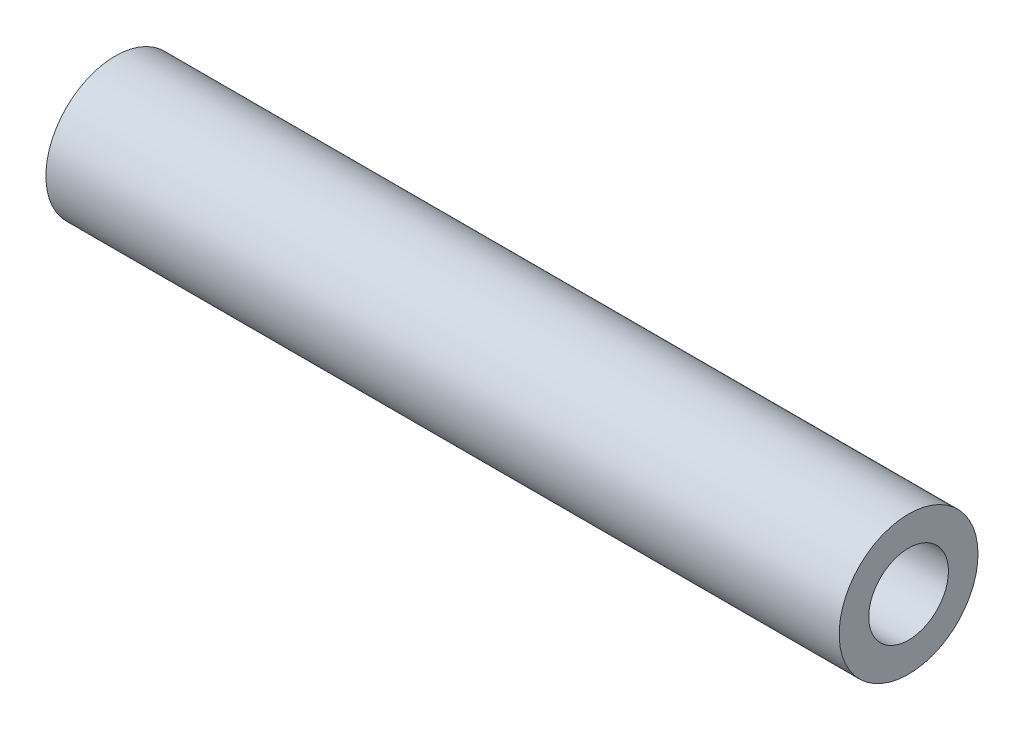
ISO-10303-21;
HEADER;
FILE_DESCRIPTION(('STEP AP214'),'2;1');
FILE_NAME('part.step','',(''),(''),'','','');
FILE_SCHEMA(('AUTOMOTIVE_DESIGN { 1 0 10303 214 1 1 1 1 }'));
ENDSEC;
DATA;
#1=APPLICATION_CONTEXT('core data for automotive mechanical design processes');
#2=APPLICATION_PROTOCOL_DEFINITION('international standard','automotive_design',2000,#1);
#3=PRODUCT_CONTEXT('',#1,'mechanical');
#4=PRODUCT('Part','Part','',(#3));
#5=PRODUCT_RELATED_PRODUCT_CATEGORY('part','',(#4));
#6=PRODUCT_DEFINITION_FORMATION('','',#4);
#7=PRODUCT_DEFINITION_CONTEXT('part definition',#1,'design');
#8=PRODUCT_DEFINITION('design','',#6,#7);
#9=PRODUCT_DEFINITION_SHAPE('','',#8);
#10=(LENGTH_UNIT() NAMED_UNIT(*) SI_UNIT(.MILLI.,.METRE.));
#11=(NAMED_UNIT(*) PLANE_ANGLE_UNIT() SI_UNIT($,.RADIAN.));
#12=(NAMED_UNIT(*) SI_UNIT($,.STERADIAN.) SOLID_ANGLE_UNIT());
#13=UNCERTAINTY_MEASURE_WITH_UNIT(LENGTH_MEASURE(1.E-05),#10,'distance_accuracy_value','');
#14=(GEOMETRIC_REPRESENTATION_CONTEXT(3) GLOBAL_UNCERTAINTY_ASSIGNED_CONTEXT((#13)) GLOBAL_UNIT_ASSIGNED_CONTEXT((#10,
#11,#12)) REPRESENTATION_CONTEXT('',''));
#15=CARTESIAN_POINT('',(0.,0.,0.));
#16=DIRECTION('',(0.,0.,1.));
#17=DIRECTION('',(1.,0.,0.));
#18=AXIS2_PLACEMENT_3D('',#15,#16,#17);
#19=CARTESIAN_POINT('',(25.4,0.,0.));
#20=DIRECTION('',(1.,0.,0.));
#21=DIRECTION('',(0.,0.,-1.));
#22=AXIS2_PLACEMENT_3D('',#19,#20,#21);
#23=PLANE('',#22);
#24=CARTESIAN_POINT('',(25.4,0.,0.));
#25=DIRECTION('',(1.,0.,0.));
#26=DIRECTION('',(0.,0.,-1.));
#27=AXIS2_PLACEMENT_3D('',#24,#25,#26);
#28=CIRCLE('',#27,4.445);
#29=CARTESIAN_POINT('',(25.4,0.,-4.445));
#30=VERTEX_POINT('',#29);
#31=EDGE_CURVE('E12',#30,#30,#28,.T.);
#32=ORIENTED_EDGE('',*,*,#31,.T.);
#33=EDGE_LOOP('',(#32));
#34=FACE_BOUND('',#33,.T.);
#35=CARTESIAN_POINT('',(25.4,0.,0.));
#36=DIRECTION('',(1.,0.,0.));
#37=DIRECTION('',(0.,0.,-1.));
#38=AXIS2_PLACEMENT_3D('',#35,#36,#37);
#39=CIRCLE('',#38,2.5527);
#40=CARTESIAN_POINT('',(25.4,0.,-2.5527));
#41=VERTEX_POINT('',#40);
#42=EDGE_CURVE('E60',#41,#41,#39,.T.);
#43=ORIENTED_EDGE('',*,*,#42,.F.);
#44=EDGE_LOOP('',(#43));
#45=FACE_BOUND('',#44,.T.);
#46=ADVANCED_FACE('F46',(#34,#45),#23,.T.);
#47=CARTESIAN_POINT('',(-25.4,0.,0.));
#48=DIRECTION('',(1.,0.,0.));
#49=DIRECTION('',(0.,0.,-1.));
#50=AXIS2_PLACEMENT_3D('',#47,#48,#49);
#51=PLANE('',#50);
#52=CARTESIAN_POINT('',(-25.4,0.,0.));
#53=DIRECTION('',(1.,0.,0.));
#54=DIRECTION('',(0.,0.,-1.));
#55=AXIS2_PLACEMENT_3D('',#52,#53,#54);
#56=CIRCLE('',#55,4.445);
#57=CARTESIAN_POINT('',(-25.4,0.,-4.445));
#58=VERTEX_POINT('',#57);
#59=EDGE_CURVE('E50',#58,#58,#56,.T.);
#60=ORIENTED_EDGE('',*,*,#59,.F.);
#61=EDGE_LOOP('',(#60));
#62=FACE_BOUND('',#61,.T.);
#63=CARTESIAN_POINT('',(-25.4,0.,0.));
#64=DIRECTION('',(1.,0.,0.));
#65=DIRECTION('',(0.,0.,-1.));
#66=AXIS2_PLACEMENT_3D('',#63,#64,#65);
#67=CIRCLE('',#66,2.5527);
#68=CARTESIAN_POINT('',(-25.4,0.,-2.5527));
#69=VERTEX_POINT('',#68);
#70=EDGE_CURVE('E62',#69,#69,#67,.T.);
#71=ORIENTED_EDGE('',*,*,#70,.T.);
#72=EDGE_LOOP('',(#71));
#73=FACE_BOUND('',#72,.T.);
#74=ADVANCED_FACE('F75',(#62,#73),#51,.F.);
#75=CARTESIAN_POINT('',(25.4,0.,0.));
#76=DIRECTION('',(-1.,0.,0.));
#77=DIRECTION('',(0.,0.,1.));
#78=AXIS2_PLACEMENT_3D('',#75,#76,#77);
#79=CYLINDRICAL_SURFACE('',#78,4.445);
#80=ORIENTED_EDGE('',*,*,#31,.F.);
#81=EDGE_LOOP('',(#80));
#82=FACE_BOUND('',#81,.T.);
#83=ORIENTED_EDGE('',*,*,#59,.T.);
#84=EDGE_LOOP('',(#83));
#85=FACE_BOUND('',#84,.T.);
#86=ADVANCED_FACE('F48',(#82,#85),#79,.T.);
#87=CARTESIAN_POINT('',(25.4,0.,0.));
#88=DIRECTION('',(-1.,0.,0.));
#89=DIRECTION('',(0.,0.,1.));
#90=AXIS2_PLACEMENT_3D('',#87,#88,#89);
#91=CYLINDRICAL_SURFACE('',#90,2.5527);
#92=ORIENTED_EDGE('',*,*,#42,.T.);
#93=EDGE_LOOP('',(#92));
#94=FACE_BOUND('',#93,.T.);
#95=ORIENTED_EDGE('',*,*,#70,.F.);
#96=EDGE_LOOP('',(#95));
#97=FACE_BOUND('',#96,.T.);
#98=ADVANCED_FACE('F71',(#94,#97),#91,.F.);
#99=CLOSED_SHELL('',(#46,#74,#86,#98));
#100=MANIFOLD_SOLID_BREP('B2',#99);
#101=ADVANCED_BREP_SHAPE_REPRESENTATION('',(#18,#100),#14);
#102=SHAPE_DEFINITION_REPRESENTATION(#9,#101);
ENDSEC;
END-ISO-10303-21;
